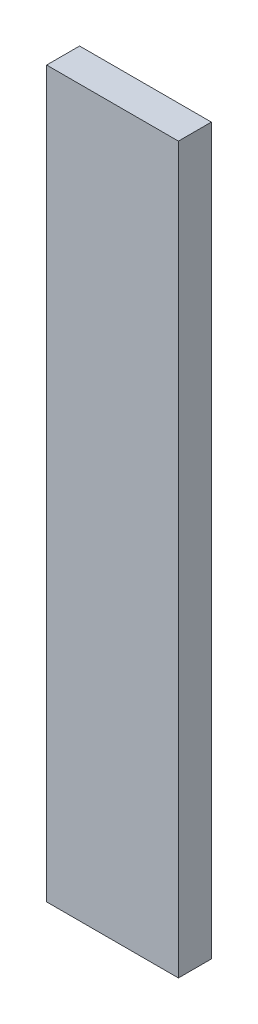
ISO-10303-21;
HEADER;
FILE_DESCRIPTION(('STEP AP214'),'2;1');
FILE_NAME('part.step','',(''),(''),'','','');
FILE_SCHEMA(('AUTOMOTIVE_DESIGN { 1 0 10303 214 1 1 1 1 }'));
ENDSEC;
DATA;
#1=APPLICATION_CONTEXT('core data for automotive mechanical design processes');
#2=APPLICATION_PROTOCOL_DEFINITION('international standard','automotive_design',2000,#1);
#3=PRODUCT_CONTEXT('',#1,'mechanical');
#4=PRODUCT('Part','Part','',(#3));
#5=PRODUCT_RELATED_PRODUCT_CATEGORY('part','',(#4));
#6=PRODUCT_DEFINITION_FORMATION('','',#4);
#7=PRODUCT_DEFINITION_CONTEXT('part definition',#1,'design');
#8=PRODUCT_DEFINITION('design','',#6,#7);
#9=PRODUCT_DEFINITION_SHAPE('','',#8);
#10=(LENGTH_UNIT() NAMED_UNIT(*) SI_UNIT(.MILLI.,.METRE.));
#11=(NAMED_UNIT(*) PLANE_ANGLE_UNIT() SI_UNIT($,.RADIAN.));
#12=(NAMED_UNIT(*) SI_UNIT($,.STERADIAN.) SOLID_ANGLE_UNIT());
#13=UNCERTAINTY_MEASURE_WITH_UNIT(LENGTH_MEASURE(1.E-05),#10,'distance_accuracy_value','');
#14=(GEOMETRIC_REPRESENTATION_CONTEXT(3) GLOBAL_UNCERTAINTY_ASSIGNED_CONTEXT((#13)) GLOBAL_UNIT_ASSIGNED_CONTEXT((#10,
#11,#12)) REPRESENTATION_CONTEXT('',''));
#15=CARTESIAN_POINT('',(0.,0.,0.));
#16=DIRECTION('',(0.,0.,1.));
#17=DIRECTION('',(1.,0.,0.));
#18=AXIS2_PLACEMENT_3D('',#15,#16,#17);
#19=CARTESIAN_POINT('',(0.,0.,12.7));
#20=DIRECTION('',(1.,0.,0.));
#21=DIRECTION('',(0.,0.,-1.));
#22=AXIS2_PLACEMENT_3D('',#19,#20,#21);
#23=PLANE('',#22);
#24=DIRECTION('',(0.,-1.,0.));
#25=VECTOR('',#24,1.);
#26=CARTESIAN_POINT('',(0.,0.,0.));
#27=LINE('',#26,#25);
#28=CARTESIAN_POINT('',(0.,279.4,0.));
#29=VERTEX_POINT('',#28);
#30=CARTESIAN_POINT('',(0.,0.,0.));
#31=VERTEX_POINT('',#30);
#32=EDGE_CURVE('E95',#29,#31,#27,.T.);
#33=ORIENTED_EDGE('',*,*,#32,.T.);
#34=DIRECTION('',(0.,0.,-1.));
#35=VECTOR('',#34,1.);
#36=CARTESIAN_POINT('',(0.,0.,12.7));
#37=LINE('',#36,#35);
#38=CARTESIAN_POINT('',(0.,0.,12.7));
#39=VERTEX_POINT('',#38);
#40=EDGE_CURVE('E11',#39,#31,#37,.T.);
#41=ORIENTED_EDGE('',*,*,#40,.F.);
#42=DIRECTION('',(0.,-1.,0.));
#43=VECTOR('',#42,1.);
#44=CARTESIAN_POINT('',(0.,0.,12.7));
#45=LINE('',#44,#43);
#46=CARTESIAN_POINT('',(0.,279.4,12.7));
#47=VERTEX_POINT('',#46);
#48=EDGE_CURVE('E83',#47,#39,#45,.T.);
#49=ORIENTED_EDGE('',*,*,#48,.F.);
#50=DIRECTION('',(0.,0.,-1.));
#51=VECTOR('',#50,1.);
#52=CARTESIAN_POINT('',(0.,279.4,12.7));
#53=LINE('',#52,#51);
#54=EDGE_CURVE('E91',#47,#29,#53,.T.);
#55=ORIENTED_EDGE('',*,*,#54,.T.);
#56=EDGE_LOOP('',(#33,#41,#49,#55));
#57=FACE_BOUND('',#56,.T.);
#58=ADVANCED_FACE('F32',(#57),#23,.F.);
#59=CARTESIAN_POINT('',(0.,0.,12.7));
#60=DIRECTION('',(0.,1.,0.));
#61=DIRECTION('',(0.,0.,1.));
#62=AXIS2_PLACEMENT_3D('',#59,#60,#61);
#63=PLANE('',#62);
#64=DIRECTION('',(1.,0.,0.));
#65=VECTOR('',#64,1.);
#66=CARTESIAN_POINT('',(0.,0.,0.));
#67=LINE('',#66,#65);
#68=CARTESIAN_POINT('',(50.8,0.,0.));
#69=VERTEX_POINT('',#68);
#70=EDGE_CURVE('E87',#31,#69,#67,.T.);
#71=ORIENTED_EDGE('',*,*,#70,.T.);
#72=DIRECTION('',(0.,0.,-1.));
#73=VECTOR('',#72,1.);
#74=CARTESIAN_POINT('',(50.8,0.,12.7));
#75=LINE('',#74,#73);
#76=CARTESIAN_POINT('',(50.8,0.,12.7));
#77=VERTEX_POINT('',#76);
#78=EDGE_CURVE('E40',#77,#69,#75,.T.);
#79=ORIENTED_EDGE('',*,*,#78,.F.);
#80=DIRECTION('',(1.,0.,0.));
#81=VECTOR('',#80,1.);
#82=CARTESIAN_POINT('',(0.,0.,12.7));
#83=LINE('',#82,#81);
#84=EDGE_CURVE('E78',#39,#77,#83,.T.);
#85=ORIENTED_EDGE('',*,*,#84,.F.);
#86=ORIENTED_EDGE('',*,*,#40,.T.);
#87=EDGE_LOOP('',(#71,#79,#85,#86));
#88=FACE_BOUND('',#87,.T.);
#89=ADVANCED_FACE('F86',(#88),#63,.F.);
#90=CARTESIAN_POINT('',(50.8,0.,12.7));
#91=DIRECTION('',(-1.,0.,0.));
#92=DIRECTION('',(0.,0.,1.));
#93=AXIS2_PLACEMENT_3D('',#90,#91,#92);
#94=PLANE('',#93);
#95=DIRECTION('',(0.,1.,0.));
#96=VECTOR('',#95,1.);
#97=CARTESIAN_POINT('',(50.8,0.,0.));
#98=LINE('',#97,#96);
#99=CARTESIAN_POINT('',(50.8,279.4,0.));
#100=VERTEX_POINT('',#99);
#101=EDGE_CURVE('E65',#69,#100,#98,.T.);
#102=ORIENTED_EDGE('',*,*,#101,.T.);
#103=DIRECTION('',(0.,0.,-1.));
#104=VECTOR('',#103,1.);
#105=CARTESIAN_POINT('',(50.8,279.4,12.7));
#106=LINE('',#105,#104);
#107=CARTESIAN_POINT('',(50.8,279.4,12.7));
#108=VERTEX_POINT('',#107);
#109=EDGE_CURVE('E88',#108,#100,#106,.T.);
#110=ORIENTED_EDGE('',*,*,#109,.F.);
#111=DIRECTION('',(0.,1.,0.));
#112=VECTOR('',#111,1.);
#113=CARTESIAN_POINT('',(50.8,0.,12.7));
#114=LINE('',#113,#112);
#115=EDGE_CURVE('E81',#77,#108,#114,.T.);
#116=ORIENTED_EDGE('',*,*,#115,.F.);
#117=ORIENTED_EDGE('',*,*,#78,.T.);
#118=EDGE_LOOP('',(#102,#110,#116,#117));
#119=FACE_BOUND('',#118,.T.);
#120=ADVANCED_FACE('F89',(#119),#94,.F.);
#121=CARTESIAN_POINT('',(0.,279.4,12.7));
#122=DIRECTION('',(0.,-1.,0.));
#123=DIRECTION('',(0.,0.,-1.));
#124=AXIS2_PLACEMENT_3D('',#121,#122,#123);
#125=PLANE('',#124);
#126=DIRECTION('',(-1.,0.,0.));
#127=VECTOR('',#126,1.);
#128=CARTESIAN_POINT('',(0.,279.4,0.));
#129=LINE('',#128,#127);
#130=EDGE_CURVE('E71',#100,#29,#129,.T.);
#131=ORIENTED_EDGE('',*,*,#130,.T.);
#132=ORIENTED_EDGE('',*,*,#54,.F.);
#133=DIRECTION('',(-1.,0.,0.));
#134=VECTOR('',#133,1.);
#135=CARTESIAN_POINT('',(0.,279.4,12.7));
#136=LINE('',#135,#134);
#137=EDGE_CURVE('E48',#108,#47,#136,.T.);
#138=ORIENTED_EDGE('',*,*,#137,.F.);
#139=ORIENTED_EDGE('',*,*,#109,.T.);
#140=EDGE_LOOP('',(#131,#132,#138,#139));
#141=FACE_BOUND('',#140,.T.);
#142=ADVANCED_FACE('F102',(#141),#125,.F.);
#143=CARTESIAN_POINT('',(0.,0.,12.7));
#144=DIRECTION('',(0.,0.,-1.));
#145=DIRECTION('',(-1.,0.,0.));
#146=AXIS2_PLACEMENT_3D('',#143,#144,#145);
#147=PLANE('',#146);
#148=ORIENTED_EDGE('',*,*,#48,.T.);
#149=ORIENTED_EDGE('',*,*,#84,.T.);
#150=ORIENTED_EDGE('',*,*,#115,.T.);
#151=ORIENTED_EDGE('',*,*,#137,.T.);
#152=EDGE_LOOP('',(#148,#149,#150,#151));
#153=FACE_BOUND('',#152,.T.);
#154=ADVANCED_FACE('F79',(#153),#147,.F.);
#155=CARTESIAN_POINT('',(0.,0.,0.));
#156=DIRECTION('',(0.,0.,-1.));
#157=DIRECTION('',(-1.,0.,0.));
#158=AXIS2_PLACEMENT_3D('',#155,#156,#157);
#159=PLANE('',#158);
#160=ORIENTED_EDGE('',*,*,#32,.F.);
#161=ORIENTED_EDGE('',*,*,#130,.F.);
#162=ORIENTED_EDGE('',*,*,#101,.F.);
#163=ORIENTED_EDGE('',*,*,#70,.F.);
#164=EDGE_LOOP('',(#160,#161,#162,#163));
#165=FACE_BOUND('',#164,.T.);
#166=ADVANCED_FACE('F105',(#165),#159,.T.);
#167=CLOSED_SHELL('',(#58,#89,#120,#142,#154,#166));
#168=MANIFOLD_SOLID_BREP('B2',#167);
#169=ADVANCED_BREP_SHAPE_REPRESENTATION('',(#18,#168),#14);
#170=SHAPE_DEFINITION_REPRESENTATION(#9,#169);
ENDSEC;
END-ISO-10303-21;
